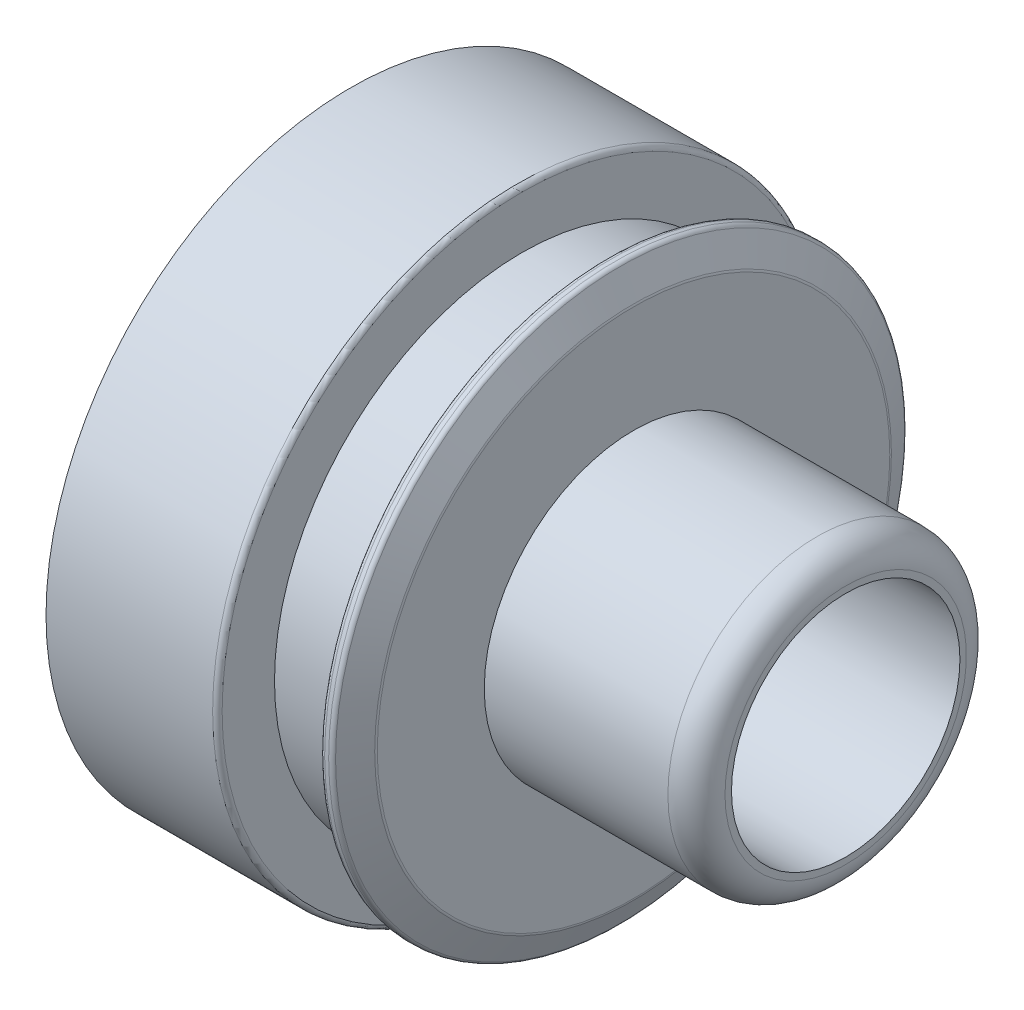
ISO-10303-21;
HEADER;
FILE_DESCRIPTION(('STEP AP214'),'2;1');
FILE_NAME('part.step','',(''),(''),'','','');
FILE_SCHEMA(('AUTOMOTIVE_DESIGN { 1 0 10303 214 1 1 1 1 }'));
ENDSEC;
DATA;
#1=APPLICATION_CONTEXT('core data for automotive mechanical design processes');
#2=APPLICATION_PROTOCOL_DEFINITION('international standard','automotive_design',2000,#1);
#3=PRODUCT_CONTEXT('',#1,'mechanical');
#4=PRODUCT('Part','Part','',(#3));
#5=PRODUCT_RELATED_PRODUCT_CATEGORY('part','',(#4));
#6=PRODUCT_DEFINITION_FORMATION('','',#4);
#7=PRODUCT_DEFINITION_CONTEXT('part definition',#1,'design');
#8=PRODUCT_DEFINITION('design','',#6,#7);
#9=PRODUCT_DEFINITION_SHAPE('','',#8);
#10=(LENGTH_UNIT() NAMED_UNIT(*) SI_UNIT(.MILLI.,.METRE.));
#11=(NAMED_UNIT(*) PLANE_ANGLE_UNIT() SI_UNIT($,.RADIAN.));
#12=(NAMED_UNIT(*) SI_UNIT($,.STERADIAN.) SOLID_ANGLE_UNIT());
#13=UNCERTAINTY_MEASURE_WITH_UNIT(LENGTH_MEASURE(1.E-05),#10,'distance_accuracy_value','');
#14=(GEOMETRIC_REPRESENTATION_CONTEXT(3) GLOBAL_UNCERTAINTY_ASSIGNED_CONTEXT((#13)) GLOBAL_UNIT_ASSIGNED_CONTEXT((#10,
#11,#12)) REPRESENTATION_CONTEXT('',''));
#15=CARTESIAN_POINT('',(0.,0.,0.));
#16=DIRECTION('',(0.,0.,1.));
#17=DIRECTION('',(1.,0.,0.));
#18=AXIS2_PLACEMENT_3D('',#15,#16,#17);
#19=CARTESIAN_POINT('',(0.,0.,-7.01282337392927));
#20=DIRECTION('',(1.,0.,0.));
#21=DIRECTION('',(0.,0.,-1.));
#22=AXIS2_PLACEMENT_3D('',#19,#20,#21);
#23=PLANE('',#22);
#24=CARTESIAN_POINT('',(0.,0.,0.));
#25=DIRECTION('',(-1.,0.,0.));
#26=DIRECTION('',(0.,0.,1.));
#27=AXIS2_PLACEMENT_3D('',#24,#25,#26);
#28=CIRCLE('',#27,5.);
#29=CARTESIAN_POINT('',(0.,0.,5.));
#30=VERTEX_POINT('',#29);
#31=EDGE_CURVE('E10',#30,#30,#28,.T.);
#32=ORIENTED_EDGE('',*,*,#31,.F.);
#33=EDGE_LOOP('',(#32));
#34=FACE_BOUND('',#33,.T.);
#35=CARTESIAN_POINT('',(0.,0.,0.));
#36=DIRECTION('',(-1.,0.,0.));
#37=DIRECTION('',(0.,0.,1.));
#38=AXIS2_PLACEMENT_3D('',#35,#36,#37);
#39=CIRCLE('',#38,7.01282337392927);
#40=CARTESIAN_POINT('',(0.,0.,7.01282337392927));
#41=VERTEX_POINT('',#40);
#42=EDGE_CURVE('E129',#41,#41,#39,.T.);
#43=ORIENTED_EDGE('',*,*,#42,.T.);
#44=EDGE_LOOP('',(#43));
#45=FACE_BOUND('',#44,.T.);
#46=ADVANCED_FACE('F35',(#34,#45),#23,.F.);
#47=CARTESIAN_POINT('',(0.,0.,0.));
#48=DIRECTION('',(-1.,0.,0.));
#49=DIRECTION('',(0.,0.,1.));
#50=AXIS2_PLACEMENT_3D('',#47,#48,#49);
#51=CYLINDRICAL_SURFACE('',#50,5.);
#52=CARTESIAN_POINT('',(1.25,0.,0.));
#53=DIRECTION('',(-1.,0.,0.));
#54=DIRECTION('',(0.,0.,1.));
#55=AXIS2_PLACEMENT_3D('',#52,#53,#54);
#56=CIRCLE('',#55,5.);
#57=CARTESIAN_POINT('',(1.25,0.,5.));
#58=VERTEX_POINT('',#57);
#59=EDGE_CURVE('E41',#58,#58,#56,.T.);
#60=ORIENTED_EDGE('',*,*,#59,.F.);
#61=EDGE_LOOP('',(#60));
#62=FACE_BOUND('',#61,.T.);
#63=ORIENTED_EDGE('',*,*,#31,.T.);
#64=EDGE_LOOP('',(#63));
#65=FACE_BOUND('',#64,.T.);
#66=ADVANCED_FACE('F298',(#62,#65),#51,.F.);
#67=CARTESIAN_POINT('',(1.25,0.,0.));
#68=DIRECTION('',(-1.,0.,0.));
#69=DIRECTION('',(0.,0.,1.));
#70=AXIS2_PLACEMENT_3D('',#67,#68,#69);
#71=TOROIDAL_SURFACE('',#70,4.75,0.25);
#72=CARTESIAN_POINT('',(1.5,0.,0.));
#73=DIRECTION('',(-1.,0.,0.));
#74=DIRECTION('',(0.,0.,1.));
#75=AXIS2_PLACEMENT_3D('',#72,#73,#74);
#76=CIRCLE('',#75,4.75);
#77=CARTESIAN_POINT('',(1.5,0.,4.75));
#78=VERTEX_POINT('',#77);
#79=EDGE_CURVE('E45',#78,#78,#76,.T.);
#80=ORIENTED_EDGE('',*,*,#79,.F.);
#81=EDGE_LOOP('',(#80));
#82=FACE_BOUND('',#81,.T.);
#83=ORIENTED_EDGE('',*,*,#59,.T.);
#84=EDGE_LOOP('',(#83));
#85=FACE_BOUND('',#84,.T.);
#86=ADVANCED_FACE('F293',(#82,#85),#71,.F.);
#87=CARTESIAN_POINT('',(1.5,0.,-4.75));
#88=DIRECTION('',(1.,0.,0.));
#89=DIRECTION('',(0.,0.,-1.));
#90=AXIS2_PLACEMENT_3D('',#87,#88,#89);
#91=PLANE('',#90);
#92=CARTESIAN_POINT('',(1.5,0.,0.));
#93=DIRECTION('',(-1.,0.,0.));
#94=DIRECTION('',(0.,0.,1.));
#95=AXIS2_PLACEMENT_3D('',#92,#93,#94);
#96=CIRCLE('',#95,4.);
#97=CARTESIAN_POINT('',(1.5,0.,4.));
#98=VERTEX_POINT('',#97);
#99=EDGE_CURVE('E49',#98,#98,#96,.T.);
#100=ORIENTED_EDGE('',*,*,#99,.F.);
#101=EDGE_LOOP('',(#100));
#102=FACE_BOUND('',#101,.T.);
#103=ORIENTED_EDGE('',*,*,#79,.T.);
#104=EDGE_LOOP('',(#103));
#105=FACE_BOUND('',#104,.T.);
#106=ADVANCED_FACE('F287',(#102,#105),#91,.F.);
#107=CARTESIAN_POINT('',(0.,0.,0.));
#108=DIRECTION('',(-1.,0.,0.));
#109=DIRECTION('',(0.,0.,1.));
#110=AXIS2_PLACEMENT_3D('',#107,#108,#109);
#111=CYLINDRICAL_SURFACE('',#110,4.);
#112=CARTESIAN_POINT('',(14.5,0.,0.));
#113=DIRECTION('',(-1.,0.,0.));
#114=DIRECTION('',(0.,0.,1.));
#115=AXIS2_PLACEMENT_3D('',#112,#113,#114);
#116=CIRCLE('',#115,4.);
#117=CARTESIAN_POINT('',(14.5,0.,4.));
#118=VERTEX_POINT('',#117);
#119=EDGE_CURVE('E54',#118,#118,#116,.T.);
#120=ORIENTED_EDGE('',*,*,#119,.F.);
#121=EDGE_LOOP('',(#120));
#122=FACE_BOUND('',#121,.T.);
#123=ORIENTED_EDGE('',*,*,#99,.T.);
#124=EDGE_LOOP('',(#123));
#125=FACE_BOUND('',#124,.T.);
#126=ADVANCED_FACE('F281',(#122,#125),#111,.F.);
#127=CARTESIAN_POINT('',(14.5,0.,-4.));
#128=DIRECTION('',(-1.,0.,0.));
#129=DIRECTION('',(0.,0.,1.));
#130=AXIS2_PLACEMENT_3D('',#127,#128,#129);
#131=PLANE('',#130);
#132=CARTESIAN_POINT('',(14.5,0.,0.));
#133=DIRECTION('',(-1.,0.,0.));
#134=DIRECTION('',(0.,0.,1.));
#135=AXIS2_PLACEMENT_3D('',#132,#133,#134);
#136=CIRCLE('',#135,6.);
#137=CARTESIAN_POINT('',(14.5,0.,6.));
#138=VERTEX_POINT('',#137);
#139=EDGE_CURVE('E57',#138,#138,#136,.T.);
#140=ORIENTED_EDGE('',*,*,#139,.F.);
#141=EDGE_LOOP('',(#140));
#142=FACE_BOUND('',#141,.T.);
#143=ORIENTED_EDGE('',*,*,#119,.T.);
#144=EDGE_LOOP('',(#143));
#145=FACE_BOUND('',#144,.T.);
#146=ADVANCED_FACE('F275',(#142,#145),#131,.F.);
#147=CARTESIAN_POINT('',(0.,0.,0.));
#148=DIRECTION('',(-1.,0.,0.));
#149=DIRECTION('',(0.,0.,1.));
#150=AXIS2_PLACEMENT_3D('',#147,#148,#149);
#151=CYLINDRICAL_SURFACE('',#150,6.);
#152=CARTESIAN_POINT('',(26.5,0.,0.));
#153=DIRECTION('',(-1.,0.,0.));
#154=DIRECTION('',(0.,0.,1.));
#155=AXIS2_PLACEMENT_3D('',#152,#153,#154);
#156=CIRCLE('',#155,6.);
#157=CARTESIAN_POINT('',(26.5,0.,6.));
#158=VERTEX_POINT('',#157);
#159=EDGE_CURVE('E60',#158,#158,#156,.T.);
#160=ORIENTED_EDGE('',*,*,#159,.F.);
#161=EDGE_LOOP('',(#160));
#162=FACE_BOUND('',#161,.T.);
#163=ORIENTED_EDGE('',*,*,#139,.T.);
#164=EDGE_LOOP('',(#163));
#165=FACE_BOUND('',#164,.T.);
#166=ADVANCED_FACE('F269',(#162,#165),#151,.F.);
#167=CARTESIAN_POINT('',(26.5,0.,-6.));
#168=DIRECTION('',(-1.,0.,0.));
#169=DIRECTION('',(0.,0.,1.));
#170=AXIS2_PLACEMENT_3D('',#167,#168,#169);
#171=PLANE('',#170);
#172=CARTESIAN_POINT('',(26.5,0.,0.));
#173=DIRECTION('',(-1.,0.,0.));
#174=DIRECTION('',(0.,0.,1.));
#175=AXIS2_PLACEMENT_3D('',#172,#173,#174);
#176=CIRCLE('',#175,6.34);
#177=CARTESIAN_POINT('',(26.5,0.,6.34));
#178=VERTEX_POINT('',#177);
#179=EDGE_CURVE('E63',#178,#178,#176,.T.);
#180=ORIENTED_EDGE('',*,*,#179,.F.);
#181=EDGE_LOOP('',(#180));
#182=FACE_BOUND('',#181,.T.);
#183=ORIENTED_EDGE('',*,*,#159,.T.);
#184=EDGE_LOOP('',(#183));
#185=FACE_BOUND('',#184,.T.);
#186=ADVANCED_FACE('F263',(#182,#185),#171,.F.);
#187=CARTESIAN_POINT('',(25.,0.,0.));
#188=DIRECTION('',(-1.,0.,0.));
#189=DIRECTION('',(0.,0.,1.));
#190=AXIS2_PLACEMENT_3D('',#187,#188,#189);
#191=TOROIDAL_SURFACE('',#190,6.34,1.5);
#192=CARTESIAN_POINT('',(25.,0.,0.));
#193=DIRECTION('',(-1.,0.,0.));
#194=DIRECTION('',(0.,0.,1.));
#195=AXIS2_PLACEMENT_3D('',#192,#193,#194);
#196=CIRCLE('',#195,7.84);
#197=CARTESIAN_POINT('',(25.,0.,7.84));
#198=VERTEX_POINT('',#197);
#199=EDGE_CURVE('E66',#198,#198,#196,.T.);
#200=ORIENTED_EDGE('',*,*,#199,.F.);
#201=EDGE_LOOP('',(#200));
#202=FACE_BOUND('',#201,.T.);
#203=ORIENTED_EDGE('',*,*,#179,.T.);
#204=EDGE_LOOP('',(#203));
#205=FACE_BOUND('',#204,.T.);
#206=ADVANCED_FACE('F257',(#202,#205),#191,.T.);
#207=CARTESIAN_POINT('',(0.,0.,0.));
#208=DIRECTION('',(-1.,0.,0.));
#209=DIRECTION('',(0.,0.,1.));
#210=AXIS2_PLACEMENT_3D('',#207,#208,#209);
#211=CYLINDRICAL_SURFACE('',#210,7.84);
#212=CARTESIAN_POINT('',(15.3570034906106,0.,0.));
#213=DIRECTION('',(-1.,0.,0.));
#214=DIRECTION('',(0.,0.,1.));
#215=AXIS2_PLACEMENT_3D('',#212,#213,#214);
#216=CIRCLE('',#215,7.84);
#217=CARTESIAN_POINT('',(15.3570034906106,0.,7.84));
#218=VERTEX_POINT('',#217);
#219=EDGE_CURVE('E69',#218,#218,#216,.T.);
#220=ORIENTED_EDGE('',*,*,#219,.F.);
#221=EDGE_LOOP('',(#220));
#222=FACE_BOUND('',#221,.T.);
#223=ORIENTED_EDGE('',*,*,#199,.T.);
#224=EDGE_LOOP('',(#223));
#225=FACE_BOUND('',#224,.T.);
#226=ADVANCED_FACE('F251',(#222,#225),#211,.T.);
#227=CARTESIAN_POINT('',(15.3570034906106,0.,-7.84));
#228=DIRECTION('',(-1.,0.,0.));
#229=DIRECTION('',(0.,0.,1.));
#230=AXIS2_PLACEMENT_3D('',#227,#228,#229);
#231=PLANE('',#230);
#232=CARTESIAN_POINT('',(15.3570034906106,0.,0.));
#233=DIRECTION('',(-1.,0.,0.));
#234=DIRECTION('',(0.,0.,1.));
#235=AXIS2_PLACEMENT_3D('',#232,#233,#234);
#236=CIRCLE('',#235,13.4584074606541);
#237=CARTESIAN_POINT('',(15.3570034906106,0.,13.4584074606541));
#238=VERTEX_POINT('',#237);
#239=EDGE_CURVE('E72',#238,#238,#236,.T.);
#240=ORIENTED_EDGE('',*,*,#239,.F.);
#241=EDGE_LOOP('',(#240));
#242=FACE_BOUND('',#241,.T.);
#243=ORIENTED_EDGE('',*,*,#219,.T.);
#244=EDGE_LOOP('',(#243));
#245=FACE_BOUND('',#244,.T.);
#246=ADVANCED_FACE('F245',(#242,#245),#231,.F.);
#247=CARTESIAN_POINT('',(15.1070034906106,0.,0.));
#248=DIRECTION('',(-1.,0.,0.));
#249=DIRECTION('',(0.,0.,1.));
#250=AXIS2_PLACEMENT_3D('',#247,#248,#249);
#251=TOROIDAL_SURFACE('',#250,13.4584074606541,0.249999999999999);
#252=CARTESIAN_POINT('',(15.3311320698194,0.,0.));
#253=DIRECTION('',(-1.,0.,0.));
#254=DIRECTION('',(0.,0.,1.));
#255=AXIS2_PLACEMENT_3D('',#252,#253,#254);
#256=CIRCLE('',#255,13.5691611512554);
#257=CARTESIAN_POINT('',(15.3311320698194,0.,13.5691611512554));
#258=VERTEX_POINT('',#257);
#259=EDGE_CURVE('E75',#258,#258,#256,.T.);
#260=ORIENTED_EDGE('',*,*,#259,.F.);
#261=EDGE_LOOP('',(#260));
#262=FACE_BOUND('',#261,.T.);
#263=ORIENTED_EDGE('',*,*,#239,.T.);
#264=EDGE_LOOP('',(#263));
#265=FACE_BOUND('',#264,.T.);
#266=ADVANCED_FACE('F239',(#262,#265),#251,.T.);
#267=CARTESIAN_POINT('',(15.3311320698194,0.,0.));
#268=DIRECTION('',(-1.,0.,0.));
#269=DIRECTION('',(0.,0.,1.));
#270=AXIS2_PLACEMENT_3D('',#267,#268,#269);
#271=CONICAL_SURFACE('',#270,13.5691611512554,1.11183767651567);
#272=CARTESIAN_POINT('',(14.6516666792646,0.,0.));
#273=DIRECTION('',(-1.,0.,0.));
#274=DIRECTION('',(0.,0.,1.));
#275=AXIS2_PLACEMENT_3D('',#272,#273,#274);
#276=CIRCLE('',#275,14.9441727809337);
#277=CARTESIAN_POINT('',(14.6516666792646,0.,14.9441727809337));
#278=VERTEX_POINT('',#277);
#279=EDGE_CURVE('E78',#278,#278,#276,.T.);
#280=ORIENTED_EDGE('',*,*,#279,.F.);
#281=EDGE_LOOP('',(#280));
#282=FACE_BOUND('',#281,.T.);
#283=ORIENTED_EDGE('',*,*,#259,.T.);
#284=EDGE_LOOP('',(#283));
#285=FACE_BOUND('',#284,.T.);
#286=ADVANCED_FACE('F233',(#282,#285),#271,.T.);
#287=CARTESIAN_POINT('',(14.4275381000558,0.,0.));
#288=DIRECTION('',(-1.,0.,0.));
#289=DIRECTION('',(0.,0.,1.));
#290=AXIS2_PLACEMENT_3D('',#287,#288,#289);
#291=TOROIDAL_SURFACE('',#290,14.8334190903324,0.249999999999999);
#292=CARTESIAN_POINT('',(14.4275381000558,0.,0.));
#293=DIRECTION('',(-1.,0.,0.));
#294=DIRECTION('',(0.,0.,1.));
#295=AXIS2_PLACEMENT_3D('',#292,#293,#294);
#296=CIRCLE('',#295,15.0834190903324);
#297=CARTESIAN_POINT('',(14.4275381000558,0.,15.0834190903324));
#298=VERTEX_POINT('',#297);
#299=EDGE_CURVE('E81',#298,#298,#296,.T.);
#300=ORIENTED_EDGE('',*,*,#299,.F.);
#301=EDGE_LOOP('',(#300));
#302=FACE_BOUND('',#301,.T.);
#303=ORIENTED_EDGE('',*,*,#279,.T.);
#304=EDGE_LOOP('',(#303));
#305=FACE_BOUND('',#304,.T.);
#306=ADVANCED_FACE('F227',(#302,#305),#291,.T.);
#307=CARTESIAN_POINT('',(0.,0.,0.));
#308=DIRECTION('',(-1.,0.,0.));
#309=DIRECTION('',(0.,0.,1.));
#310=AXIS2_PLACEMENT_3D('',#307,#308,#309);
#311=CYLINDRICAL_SURFACE('',#310,15.0834190903324);
#312=CARTESIAN_POINT('',(14.2162487961985,0.,0.));
#313=DIRECTION('',(-1.,0.,0.));
#314=DIRECTION('',(0.,0.,1.));
#315=AXIS2_PLACEMENT_3D('',#312,#313,#314);
#316=CIRCLE('',#315,15.0834190903324);
#317=CARTESIAN_POINT('',(14.2162487961985,0.,15.0834190903324));
#318=VERTEX_POINT('',#317);
#319=EDGE_CURVE('E84',#318,#318,#316,.T.);
#320=ORIENTED_EDGE('',*,*,#319,.F.);
#321=EDGE_LOOP('',(#320));
#322=FACE_BOUND('',#321,.T.);
#323=ORIENTED_EDGE('',*,*,#299,.T.);
#324=EDGE_LOOP('',(#323));
#325=FACE_BOUND('',#324,.T.);
#326=ADVANCED_FACE('F221',(#322,#325),#311,.T.);
#327=CARTESIAN_POINT('',(14.2162487961985,0.,0.));
#328=DIRECTION('',(-1.,0.,0.));
#329=DIRECTION('',(0.,0.,1.));
#330=AXIS2_PLACEMENT_3D('',#327,#328,#329);
#331=TOROIDAL_SURFACE('',#330,14.8334190903324,0.249999999999999);
#332=CARTESIAN_POINT('',(13.9662487961985,0.,0.));
#333=DIRECTION('',(-1.,0.,0.));
#334=DIRECTION('',(0.,0.,1.));
#335=AXIS2_PLACEMENT_3D('',#332,#333,#334);
#336=CIRCLE('',#335,14.8334190903324);
#337=CARTESIAN_POINT('',(13.9662487961985,0.,14.8334190903324));
#338=VERTEX_POINT('',#337);
#339=EDGE_CURVE('E87',#338,#338,#336,.T.);
#340=ORIENTED_EDGE('',*,*,#339,.F.);
#341=EDGE_LOOP('',(#340));
#342=FACE_BOUND('',#341,.T.);
#343=ORIENTED_EDGE('',*,*,#319,.T.);
#344=EDGE_LOOP('',(#343));
#345=FACE_BOUND('',#344,.T.);
#346=ADVANCED_FACE('F215',(#342,#345),#331,.T.);
#347=CARTESIAN_POINT('',(13.9662487961985,0.,-14.8334190903324));
#348=DIRECTION('',(1.,0.,0.));
#349=DIRECTION('',(0.,0.,-1.));
#350=AXIS2_PLACEMENT_3D('',#347,#348,#349);
#351=PLANE('',#350);
#352=CARTESIAN_POINT('',(13.9662487961985,0.,0.));
#353=DIRECTION('',(-1.,0.,0.));
#354=DIRECTION('',(0.,0.,1.));
#355=AXIS2_PLACEMENT_3D('',#352,#353,#354);
#356=CIRCLE('',#355,13.0002806592697);
#357=CARTESIAN_POINT('',(13.9662487961985,0.,13.0002806592697));
#358=VERTEX_POINT('',#357);
#359=EDGE_CURVE('E90',#358,#358,#356,.T.);
#360=ORIENTED_EDGE('',*,*,#359,.F.);
#361=EDGE_LOOP('',(#360));
#362=FACE_BOUND('',#361,.T.);
#363=ORIENTED_EDGE('',*,*,#339,.T.);
#364=EDGE_LOOP('',(#363));
#365=FACE_BOUND('',#364,.T.);
#366=ADVANCED_FACE('F209',(#362,#365),#351,.F.);
#367=CARTESIAN_POINT('',(0.,0.,0.));
#368=DIRECTION('',(-1.,0.,0.));
#369=DIRECTION('',(0.,0.,1.));
#370=AXIS2_PLACEMENT_3D('',#367,#368,#369);
#371=CYLINDRICAL_SURFACE('',#370,13.0002806592697);
#372=CARTESIAN_POINT('',(9.5,0.,0.));
#373=DIRECTION('',(-1.,0.,0.));
#374=DIRECTION('',(0.,0.,1.));
#375=AXIS2_PLACEMENT_3D('',#372,#373,#374);
#376=CIRCLE('',#375,13.0002806592697);
#377=CARTESIAN_POINT('',(9.5,0.,13.0002806592697));
#378=VERTEX_POINT('',#377);
#379=EDGE_CURVE('E93',#378,#378,#376,.T.);
#380=ORIENTED_EDGE('',*,*,#379,.F.);
#381=EDGE_LOOP('',(#380));
#382=FACE_BOUND('',#381,.T.);
#383=ORIENTED_EDGE('',*,*,#359,.T.);
#384=EDGE_LOOP('',(#383));
#385=FACE_BOUND('',#384,.T.);
#386=ADVANCED_FACE('F203',(#382,#385),#371,.T.);
#387=CARTESIAN_POINT('',(9.5,0.,-13.0002806592697));
#388=DIRECTION('',(-1.,0.,0.));
#389=DIRECTION('',(0.,0.,1.));
#390=AXIS2_PLACEMENT_3D('',#387,#388,#389);
#391=PLANE('',#390);
#392=CARTESIAN_POINT('',(9.5,0.,0.));
#393=DIRECTION('',(-1.,0.,0.));
#394=DIRECTION('',(0.,0.,1.));
#395=AXIS2_PLACEMENT_3D('',#392,#393,#394);
#396=CIRCLE('',#395,15.75);
#397=CARTESIAN_POINT('',(9.5,0.,15.75));
#398=VERTEX_POINT('',#397);
#399=EDGE_CURVE('E96',#398,#398,#396,.T.);
#400=ORIENTED_EDGE('',*,*,#399,.F.);
#401=EDGE_LOOP('',(#400));
#402=FACE_BOUND('',#401,.T.);
#403=ORIENTED_EDGE('',*,*,#379,.T.);
#404=EDGE_LOOP('',(#403));
#405=FACE_BOUND('',#404,.T.);
#406=ADVANCED_FACE('F197',(#402,#405),#391,.F.);
#407=CARTESIAN_POINT('',(9.25,0.,0.));
#408=DIRECTION('',(-1.,0.,0.));
#409=DIRECTION('',(0.,0.,1.));
#410=AXIS2_PLACEMENT_3D('',#407,#408,#409);
#411=TOROIDAL_SURFACE('',#410,15.75,0.25);
#412=CARTESIAN_POINT('',(9.25,0.,0.));
#413=DIRECTION('',(-1.,0.,0.));
#414=DIRECTION('',(0.,0.,1.));
#415=AXIS2_PLACEMENT_3D('',#412,#413,#414);
#416=CIRCLE('',#415,16.);
#417=CARTESIAN_POINT('',(9.25,0.,16.));
#418=VERTEX_POINT('',#417);
#419=EDGE_CURVE('E99',#418,#418,#416,.T.);
#420=ORIENTED_EDGE('',*,*,#419,.F.);
#421=EDGE_LOOP('',(#420));
#422=FACE_BOUND('',#421,.T.);
#423=ORIENTED_EDGE('',*,*,#399,.T.);
#424=EDGE_LOOP('',(#423));
#425=FACE_BOUND('',#424,.T.);
#426=ADVANCED_FACE('F191',(#422,#425),#411,.T.);
#427=CARTESIAN_POINT('',(0.,0.,0.));
#428=DIRECTION('',(-1.,0.,0.));
#429=DIRECTION('',(0.,0.,1.));
#430=AXIS2_PLACEMENT_3D('',#427,#428,#429);
#431=CYLINDRICAL_SURFACE('',#430,16.);
#432=CARTESIAN_POINT('',(0.499999999999999,0.,0.));
#433=DIRECTION('',(-1.,0.,0.));
#434=DIRECTION('',(0.,0.,1.));
#435=AXIS2_PLACEMENT_3D('',#432,#433,#434);
#436=CIRCLE('',#435,16.);
#437=CARTESIAN_POINT('',(0.499999999999999,0.,16.));
#438=VERTEX_POINT('',#437);
#439=EDGE_CURVE('E102',#438,#438,#436,.T.);
#440=ORIENTED_EDGE('',*,*,#439,.F.);
#441=EDGE_LOOP('',(#440));
#442=FACE_BOUND('',#441,.T.);
#443=ORIENTED_EDGE('',*,*,#419,.T.);
#444=EDGE_LOOP('',(#443));
#445=FACE_BOUND('',#444,.T.);
#446=ADVANCED_FACE('F185',(#442,#445),#431,.T.);
#447=CARTESIAN_POINT('',(0.499999999999999,0.,-16.));
#448=DIRECTION('',(1.,0.,0.));
#449=DIRECTION('',(0.,0.,-1.));
#450=AXIS2_PLACEMENT_3D('',#447,#448,#449);
#451=PLANE('',#450);
#452=CARTESIAN_POINT('',(0.499999999999999,0.,0.));
#453=DIRECTION('',(-1.,0.,0.));
#454=DIRECTION('',(0.,0.,1.));
#455=AXIS2_PLACEMENT_3D('',#452,#453,#454);
#456=CIRCLE('',#455,15.15);
#457=CARTESIAN_POINT('',(0.499999999999999,0.,15.15));
#458=VERTEX_POINT('',#457);
#459=EDGE_CURVE('E105',#458,#458,#456,.T.);
#460=ORIENTED_EDGE('',*,*,#459,.F.);
#461=EDGE_LOOP('',(#460));
#462=FACE_BOUND('',#461,.T.);
#463=ORIENTED_EDGE('',*,*,#439,.T.);
#464=EDGE_LOOP('',(#463));
#465=FACE_BOUND('',#464,.T.);
#466=ADVANCED_FACE('F179',(#462,#465),#451,.F.);
#467=CARTESIAN_POINT('',(0.,0.,0.));
#468=DIRECTION('',(-1.,0.,0.));
#469=DIRECTION('',(0.,0.,1.));
#470=AXIS2_PLACEMENT_3D('',#467,#468,#469);
#471=CYLINDRICAL_SURFACE('',#470,15.15);
#472=CARTESIAN_POINT('',(1.5545830036989,0.,0.));
#473=DIRECTION('',(-1.,0.,0.));
#474=DIRECTION('',(0.,0.,1.));
#475=AXIS2_PLACEMENT_3D('',#472,#473,#474);
#476=CIRCLE('',#475,15.15);
#477=CARTESIAN_POINT('',(1.5545830036989,0.,15.15));
#478=VERTEX_POINT('',#477);
#479=EDGE_CURVE('E108',#478,#478,#476,.T.);
#480=ORIENTED_EDGE('',*,*,#479,.F.);
#481=EDGE_LOOP('',(#480));
#482=FACE_BOUND('',#481,.T.);
#483=ORIENTED_EDGE('',*,*,#459,.T.);
#484=EDGE_LOOP('',(#483));
#485=FACE_BOUND('',#484,.T.);
#486=ADVANCED_FACE('F173',(#482,#485),#471,.F.);
#487=CARTESIAN_POINT('',(1.5545830036989,0.,-15.15));
#488=DIRECTION('',(1.,0.,0.));
#489=DIRECTION('',(0.,0.,-1.));
#490=AXIS2_PLACEMENT_3D('',#487,#488,#489);
#491=PLANE('',#490);
#492=CARTESIAN_POINT('',(1.5545830036989,0.,0.));
#493=DIRECTION('',(-1.,0.,0.));
#494=DIRECTION('',(0.,0.,1.));
#495=AXIS2_PLACEMENT_3D('',#492,#493,#494);
#496=CIRCLE('',#495,10.66);
#497=CARTESIAN_POINT('',(1.5545830036989,0.,10.66));
#498=VERTEX_POINT('',#497);
#499=EDGE_CURVE('E111',#498,#498,#496,.T.);
#500=ORIENTED_EDGE('',*,*,#499,.F.);
#501=EDGE_LOOP('',(#500));
#502=FACE_BOUND('',#501,.T.);
#503=ORIENTED_EDGE('',*,*,#479,.T.);
#504=EDGE_LOOP('',(#503));
#505=FACE_BOUND('',#504,.T.);
#506=ADVANCED_FACE('F167',(#502,#505),#491,.F.);
#507=CARTESIAN_POINT('',(1.3045830036989,0.,0.));
#508=DIRECTION('',(-1.,0.,0.));
#509=DIRECTION('',(0.,0.,1.));
#510=AXIS2_PLACEMENT_3D('',#507,#508,#509);
#511=TOROIDAL_SURFACE('',#510,10.66,0.25);
#512=CARTESIAN_POINT('',(1.3045830036989,0.,0.));
#513=DIRECTION('',(-1.,0.,0.));
#514=DIRECTION('',(0.,0.,1.));
#515=AXIS2_PLACEMENT_3D('',#512,#513,#514);
#516=CIRCLE('',#515,10.41);
#517=CARTESIAN_POINT('',(1.3045830036989,0.,10.41));
#518=VERTEX_POINT('',#517);
#519=EDGE_CURVE('E114',#518,#518,#516,.T.);
#520=ORIENTED_EDGE('',*,*,#519,.F.);
#521=EDGE_LOOP('',(#520));
#522=FACE_BOUND('',#521,.T.);
#523=ORIENTED_EDGE('',*,*,#499,.T.);
#524=EDGE_LOOP('',(#523));
#525=FACE_BOUND('',#524,.T.);
#526=ADVANCED_FACE('F161',(#522,#525),#511,.F.);
#527=CARTESIAN_POINT('',(0.,0.,0.));
#528=DIRECTION('',(-1.,0.,0.));
#529=DIRECTION('',(0.,0.,1.));
#530=AXIS2_PLACEMENT_3D('',#527,#528,#529);
#531=CYLINDRICAL_SURFACE('',#530,10.41);
#532=CARTESIAN_POINT('',(0.,0.,0.));
#533=DIRECTION('',(-1.,0.,0.));
#534=DIRECTION('',(0.,0.,1.));
#535=AXIS2_PLACEMENT_3D('',#532,#533,#534);
#536=CIRCLE('',#535,10.41);
#537=CARTESIAN_POINT('',(0.,0.,10.41));
#538=VERTEX_POINT('',#537);
#539=EDGE_CURVE('E117',#538,#538,#536,.T.);
#540=ORIENTED_EDGE('',*,*,#539,.F.);
#541=EDGE_LOOP('',(#540));
#542=FACE_BOUND('',#541,.T.);
#543=ORIENTED_EDGE('',*,*,#519,.T.);
#544=EDGE_LOOP('',(#543));
#545=FACE_BOUND('',#544,.T.);
#546=ADVANCED_FACE('F155',(#542,#545),#531,.T.);
#547=CARTESIAN_POINT('',(0.,0.,-10.41));
#548=DIRECTION('',(1.,0.,0.));
#549=DIRECTION('',(0.,0.,-1.));
#550=AXIS2_PLACEMENT_3D('',#547,#548,#549);
#551=PLANE('',#550);
#552=CARTESIAN_POINT('',(0.,0.,0.));
#553=DIRECTION('',(-1.,0.,0.));
#554=DIRECTION('',(0.,0.,1.));
#555=AXIS2_PLACEMENT_3D('',#552,#553,#554);
#556=CIRCLE('',#555,8.27261320754807);
#557=CARTESIAN_POINT('',(0.,0.,8.27261320754807));
#558=VERTEX_POINT('',#557);
#559=EDGE_CURVE('E120',#558,#558,#556,.T.);
#560=ORIENTED_EDGE('',*,*,#559,.F.);
#561=EDGE_LOOP('',(#560));
#562=FACE_BOUND('',#561,.T.);
#563=ORIENTED_EDGE('',*,*,#539,.T.);
#564=EDGE_LOOP('',(#563));
#565=FACE_BOUND('',#564,.T.);
#566=ADVANCED_FACE('F149',(#562,#565),#551,.F.);
#567=CARTESIAN_POINT('',(0.,0.,0.));
#568=DIRECTION('',(-1.,0.,0.));
#569=DIRECTION('',(0.,0.,1.));
#570=AXIS2_PLACEMENT_3D('',#567,#568,#569);
#571=CYLINDRICAL_SURFACE('',#570,8.27261320754807);
#572=CARTESIAN_POINT('',(1.5545830036989,0.,0.));
#573=DIRECTION('',(-1.,0.,0.));
#574=DIRECTION('',(0.,0.,1.));
#575=AXIS2_PLACEMENT_3D('',#572,#573,#574);
#576=CIRCLE('',#575,8.27261320754807);
#577=CARTESIAN_POINT('',(1.5545830036989,0.,8.27261320754807));
#578=VERTEX_POINT('',#577);
#579=EDGE_CURVE('E123',#578,#578,#576,.T.);
#580=ORIENTED_EDGE('',*,*,#579,.F.);
#581=EDGE_LOOP('',(#580));
#582=FACE_BOUND('',#581,.T.);
#583=ORIENTED_EDGE('',*,*,#559,.T.);
#584=EDGE_LOOP('',(#583));
#585=FACE_BOUND('',#584,.T.);
#586=ADVANCED_FACE('F143',(#582,#585),#571,.F.);
#587=CARTESIAN_POINT('',(1.5545830036989,0.,-8.27261320754807));
#588=DIRECTION('',(1.,0.,0.));
#589=DIRECTION('',(0.,0.,-1.));
#590=AXIS2_PLACEMENT_3D('',#587,#588,#589);
#591=PLANE('',#590);
#592=CARTESIAN_POINT('',(1.5545830036989,0.,0.));
#593=DIRECTION('',(-1.,0.,0.));
#594=DIRECTION('',(0.,0.,1.));
#595=AXIS2_PLACEMENT_3D('',#592,#593,#594);
#596=CIRCLE('',#595,7.01282337392927);
#597=CARTESIAN_POINT('',(1.5545830036989,0.,7.01282337392927));
#598=VERTEX_POINT('',#597);
#599=EDGE_CURVE('E126',#598,#598,#596,.T.);
#600=ORIENTED_EDGE('',*,*,#599,.F.);
#601=EDGE_LOOP('',(#600));
#602=FACE_BOUND('',#601,.T.);
#603=ORIENTED_EDGE('',*,*,#579,.T.);
#604=EDGE_LOOP('',(#603));
#605=FACE_BOUND('',#604,.T.);
#606=ADVANCED_FACE('F137',(#602,#605),#591,.F.);
#607=CARTESIAN_POINT('',(0.,0.,0.));
#608=DIRECTION('',(-1.,0.,0.));
#609=DIRECTION('',(0.,0.,1.));
#610=AXIS2_PLACEMENT_3D('',#607,#608,#609);
#611=CYLINDRICAL_SURFACE('',#610,7.01282337392927);
#612=ORIENTED_EDGE('',*,*,#42,.F.);
#613=EDGE_LOOP('',(#612));
#614=FACE_BOUND('',#613,.T.);
#615=ORIENTED_EDGE('',*,*,#599,.T.);
#616=EDGE_LOOP('',(#615));
#617=FACE_BOUND('',#616,.T.);
#618=ADVANCED_FACE('F134',(#614,#617),#611,.T.);
#619=CLOSED_SHELL('',(#46,#66,#86,#106,#126,#146,#166,#186,#206,#226,#246,#266,#286,#306,#326,
#346,#366,#386,#406,#426,#446,#466,#486,#506,#526,#546,#566,#586,#606,#618));
#620=MANIFOLD_SOLID_BREP('B2',#619);
#621=ADVANCED_BREP_SHAPE_REPRESENTATION('',(#18,#620),#14);
#622=SHAPE_DEFINITION_REPRESENTATION(#9,#621);
ENDSEC;
END-ISO-10303-21;
